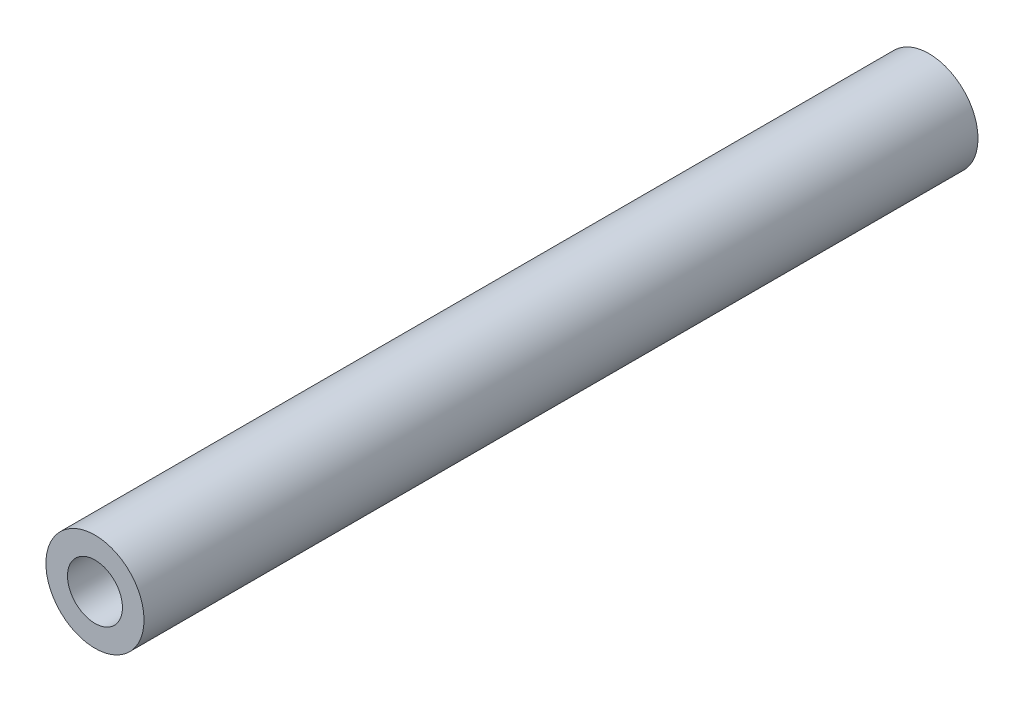
ISO-10303-21;
HEADER;
FILE_DESCRIPTION(('STEP AP214'),'2;1');
FILE_NAME('part.step','',(''),(''),'','','');
FILE_SCHEMA(('AUTOMOTIVE_DESIGN { 1 0 10303 214 1 1 1 1 }'));
ENDSEC;
DATA;
#1=APPLICATION_CONTEXT('core data for automotive mechanical design processes');
#2=APPLICATION_PROTOCOL_DEFINITION('international standard','automotive_design',2000,#1);
#3=PRODUCT_CONTEXT('',#1,'mechanical');
#4=PRODUCT('Part','Part','',(#3));
#5=PRODUCT_RELATED_PRODUCT_CATEGORY('part','',(#4));
#6=PRODUCT_DEFINITION_FORMATION('','',#4);
#7=PRODUCT_DEFINITION_CONTEXT('part definition',#1,'design');
#8=PRODUCT_DEFINITION('design','',#6,#7);
#9=PRODUCT_DEFINITION_SHAPE('','',#8);
#10=(LENGTH_UNIT() NAMED_UNIT(*) SI_UNIT(.MILLI.,.METRE.));
#11=(NAMED_UNIT(*) PLANE_ANGLE_UNIT() SI_UNIT($,.RADIAN.));
#12=(NAMED_UNIT(*) SI_UNIT($,.STERADIAN.) SOLID_ANGLE_UNIT());
#13=UNCERTAINTY_MEASURE_WITH_UNIT(LENGTH_MEASURE(1.E-05),#10,'distance_accuracy_value','');
#14=(GEOMETRIC_REPRESENTATION_CONTEXT(3) GLOBAL_UNCERTAINTY_ASSIGNED_CONTEXT((#13)) GLOBAL_UNIT_ASSIGNED_CONTEXT((#10,
#11,#12)) REPRESENTATION_CONTEXT('',''));
#15=CARTESIAN_POINT('',(0.,0.,0.));
#16=DIRECTION('',(0.,0.,1.));
#17=DIRECTION('',(1.,0.,0.));
#18=AXIS2_PLACEMENT_3D('',#15,#16,#17);
#19=CARTESIAN_POINT('',(0.,0.,53.975));
#20=DIRECTION('',(0.,0.,-1.));
#21=DIRECTION('',(-1.,0.,0.));
#22=AXIS2_PLACEMENT_3D('',#19,#20,#21);
#23=CYLINDRICAL_SURFACE('',#22,3.175);
#24=CARTESIAN_POINT('',(0.,0.,53.975));
#25=DIRECTION('',(0.,0.,1.));
#26=DIRECTION('',(1.,0.,0.));
#27=AXIS2_PLACEMENT_3D('',#24,#25,#26);
#28=CIRCLE('',#27,3.175);
#29=CARTESIAN_POINT('',(3.175,0.,53.975));
#30=VERTEX_POINT('',#29);
#31=EDGE_CURVE('E10',#30,#30,#28,.T.);
#32=ORIENTED_EDGE('',*,*,#31,.F.);
#33=EDGE_LOOP('',(#32));
#34=FACE_BOUND('',#33,.T.);
#35=CARTESIAN_POINT('',(0.,0.,0.));
#36=DIRECTION('',(0.,0.,1.));
#37=DIRECTION('',(1.,0.,0.));
#38=AXIS2_PLACEMENT_3D('',#35,#36,#37);
#39=CIRCLE('',#38,3.175);
#40=CARTESIAN_POINT('',(3.175,0.,0.));
#41=VERTEX_POINT('',#40);
#42=EDGE_CURVE('E35',#41,#41,#39,.T.);
#43=ORIENTED_EDGE('',*,*,#42,.T.);
#44=EDGE_LOOP('',(#43));
#45=FACE_BOUND('',#44,.T.);
#46=ADVANCED_FACE('F32',(#34,#45),#23,.T.);
#47=CARTESIAN_POINT('',(0.,0.,53.975));
#48=DIRECTION('',(0.,0.,1.));
#49=DIRECTION('',(1.,0.,0.));
#50=AXIS2_PLACEMENT_3D('',#47,#48,#49);
#51=PLANE('',#50);
#52=CARTESIAN_POINT('',(0.,0.,53.975));
#53=DIRECTION('',(0.,0.,1.));
#54=DIRECTION('',(1.,0.,0.));
#55=AXIS2_PLACEMENT_3D('',#52,#53,#54);
#56=CIRCLE('',#55,1.778);
#57=CARTESIAN_POINT('',(1.778,0.,53.975));
#58=VERTEX_POINT('',#57);
#59=EDGE_CURVE('E44',#58,#58,#56,.T.);
#60=ORIENTED_EDGE('',*,*,#59,.F.);
#61=EDGE_LOOP('',(#60));
#62=FACE_BOUND('',#61,.T.);
#63=ORIENTED_EDGE('',*,*,#31,.T.);
#64=EDGE_LOOP('',(#63));
#65=FACE_BOUND('',#64,.T.);
#66=ADVANCED_FACE('F59',(#62,#65),#51,.T.);
#67=CARTESIAN_POINT('',(0.,0.,0.));
#68=DIRECTION('',(0.,0.,1.));
#69=DIRECTION('',(1.,0.,0.));
#70=AXIS2_PLACEMENT_3D('',#67,#68,#69);
#71=PLANE('',#70);
#72=CARTESIAN_POINT('',(0.,0.,0.));
#73=DIRECTION('',(0.,0.,1.));
#74=DIRECTION('',(1.,0.,0.));
#75=AXIS2_PLACEMENT_3D('',#72,#73,#74);
#76=CIRCLE('',#75,1.778);
#77=CARTESIAN_POINT('',(1.778,0.,0.));
#78=VERTEX_POINT('',#77);
#79=EDGE_CURVE('E42',#78,#78,#76,.T.);
#80=ORIENTED_EDGE('',*,*,#79,.T.);
#81=EDGE_LOOP('',(#80));
#82=FACE_BOUND('',#81,.T.);
#83=ORIENTED_EDGE('',*,*,#42,.F.);
#84=EDGE_LOOP('',(#83));
#85=FACE_BOUND('',#84,.T.);
#86=ADVANCED_FACE('F50',(#82,#85),#71,.F.);
#87=CARTESIAN_POINT('',(0.,0.,0.));
#88=DIRECTION('',(0.,0.,1.));
#89=DIRECTION('',(1.,0.,0.));
#90=AXIS2_PLACEMENT_3D('',#87,#88,#89);
#91=CYLINDRICAL_SURFACE('',#90,1.778);
#92=ORIENTED_EDGE('',*,*,#79,.F.);
#93=EDGE_LOOP('',(#92));
#94=FACE_BOUND('',#93,.T.);
#95=ORIENTED_EDGE('',*,*,#59,.T.);
#96=EDGE_LOOP('',(#95));
#97=FACE_BOUND('',#96,.T.);
#98=ADVANCED_FACE('F53',(#94,#97),#91,.F.);
#99=CLOSED_SHELL('',(#46,#66,#86,#98));
#100=MANIFOLD_SOLID_BREP('B2',#99);
#101=ADVANCED_BREP_SHAPE_REPRESENTATION('',(#18,#100),#14);
#102=SHAPE_DEFINITION_REPRESENTATION(#9,#101);
ENDSEC;
END-ISO-10303-21;
